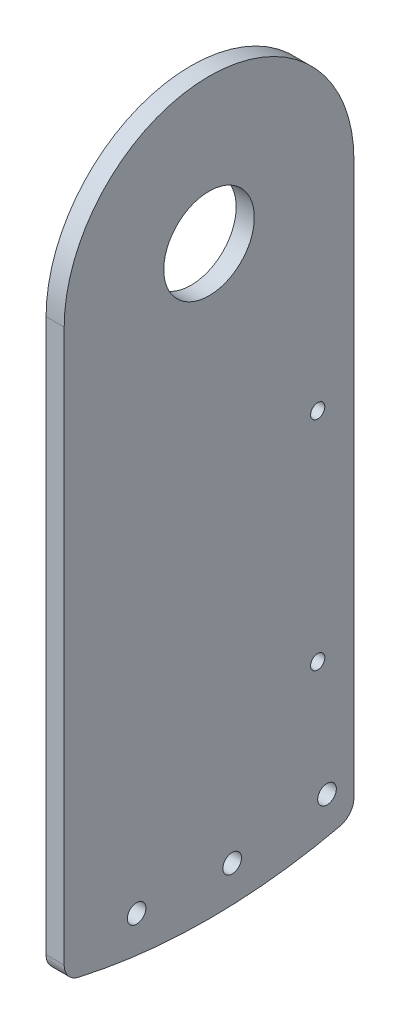
ISO-10303-21;
HEADER;
FILE_DESCRIPTION(('STEP AP214'),'2;1');
FILE_NAME('part.step','',(''),(''),'','','');
FILE_SCHEMA(('AUTOMOTIVE_DESIGN { 1 0 10303 214 1 1 1 1 }'));
ENDSEC;
DATA;
#1=APPLICATION_CONTEXT('core data for automotive mechanical design processes');
#2=APPLICATION_PROTOCOL_DEFINITION('international standard','automotive_design',2000,#1);
#3=PRODUCT_CONTEXT('',#1,'mechanical');
#4=PRODUCT('Part','Part','',(#3));
#5=PRODUCT_RELATED_PRODUCT_CATEGORY('part','',(#4));
#6=PRODUCT_DEFINITION_FORMATION('','',#4);
#7=PRODUCT_DEFINITION_CONTEXT('part definition',#1,'design');
#8=PRODUCT_DEFINITION('design','',#6,#7);
#9=PRODUCT_DEFINITION_SHAPE('','',#8);
#10=(LENGTH_UNIT() NAMED_UNIT(*) SI_UNIT(.MILLI.,.METRE.));
#11=(NAMED_UNIT(*) PLANE_ANGLE_UNIT() SI_UNIT($,.RADIAN.));
#12=(NAMED_UNIT(*) SI_UNIT($,.STERADIAN.) SOLID_ANGLE_UNIT());
#13=UNCERTAINTY_MEASURE_WITH_UNIT(LENGTH_MEASURE(1.E-05),#10,'distance_accuracy_value','');
#14=(GEOMETRIC_REPRESENTATION_CONTEXT(3) GLOBAL_UNCERTAINTY_ASSIGNED_CONTEXT((#13)) GLOBAL_UNIT_ASSIGNED_CONTEXT((#10,
#11,#12)) REPRESENTATION_CONTEXT('',''));
#15=CARTESIAN_POINT('',(0.,0.,0.));
#16=DIRECTION('',(0.,0.,1.));
#17=DIRECTION('',(1.,0.,0.));
#18=AXIS2_PLACEMENT_3D('',#15,#16,#17);
#19=CARTESIAN_POINT('',(6.35,0.,0.));
#20=DIRECTION('',(-1.,0.,0.));
#21=DIRECTION('',(0.,0.,-1.));
#22=AXIS2_PLACEMENT_3D('',#19,#20,#21);
#23=PLANE('',#22);
#24=CARTESIAN_POINT('',(6.35,-146.05,-38.1));
#25=DIRECTION('',(-1.,0.,0.));
#26=DIRECTION('',(0.,0.,1.));
#27=AXIS2_PLACEMENT_3D('',#24,#25,#26);
#28=CIRCLE('',#27,2.4892);
#29=CARTESIAN_POINT('',(6.35,-146.05,-35.6108));
#30=VERTEX_POINT('',#29);
#31=EDGE_CURVE('E289',#30,#30,#28,.T.);
#32=ORIENTED_EDGE('',*,*,#31,.T.);
#33=EDGE_LOOP('',(#32));
#34=FACE_BOUND('',#33,.T.);
#35=CARTESIAN_POINT('',(6.35,-69.85,-38.1));
#36=DIRECTION('',(-1.,0.,0.));
#37=DIRECTION('',(0.,0.,1.));
#38=AXIS2_PLACEMENT_3D('',#35,#36,#37);
#39=CIRCLE('',#38,2.48919999999998);
#40=CARTESIAN_POINT('',(6.35,-69.85,-35.6108));
#41=VERTEX_POINT('',#40);
#42=EDGE_CURVE('E291',#41,#41,#39,.T.);
#43=ORIENTED_EDGE('',*,*,#42,.T.);
#44=EDGE_LOOP('',(#43));
#45=FACE_BOUND('',#44,.T.);
#46=CARTESIAN_POINT('',(6.35,-190.721063401503,25.4));
#47=DIRECTION('',(-1.,0.,0.));
#48=DIRECTION('',(0.,0.,1.));
#49=AXIS2_PLACEMENT_3D('',#46,#47,#48);
#50=CIRCLE('',#49,3.26389999999999);
#51=CARTESIAN_POINT('',(6.35,-190.721063401503,28.6639));
#52=VERTEX_POINT('',#51);
#53=EDGE_CURVE('E299',#52,#52,#50,.T.);
#54=ORIENTED_EDGE('',*,*,#53,.T.);
#55=EDGE_LOOP('',(#54));
#56=FACE_BOUND('',#55,.T.);
#57=CARTESIAN_POINT('',(6.35,-192.234245613273,-8.10424817586003));
#58=DIRECTION('',(-1.,0.,0.));
#59=DIRECTION('',(0.,0.,1.));
#60=AXIS2_PLACEMENT_3D('',#57,#58,#59);
#61=CIRCLE('',#60,3.26389999999999);
#62=CARTESIAN_POINT('',(6.35,-192.234245613273,-4.84034817586005));
#63=VERTEX_POINT('',#62);
#64=EDGE_CURVE('E305',#63,#63,#61,.T.);
#65=ORIENTED_EDGE('',*,*,#64,.T.);
#66=EDGE_LOOP('',(#65));
#67=FACE_BOUND('',#66,.T.);
#68=CARTESIAN_POINT('',(6.35,-187.906487547305,-41.362252871844));
#69=DIRECTION('',(-1.,0.,0.));
#70=DIRECTION('',(0.,0.,1.));
#71=AXIS2_PLACEMENT_3D('',#68,#69,#70);
#72=CIRCLE('',#71,3.26389999999999);
#73=CARTESIAN_POINT('',(6.35,-187.906487547305,-38.098352871844));
#74=VERTEX_POINT('',#73);
#75=EDGE_CURVE('E311',#74,#74,#72,.T.);
#76=ORIENTED_EDGE('',*,*,#75,.T.);
#77=EDGE_LOOP('',(#76));
#78=FACE_BOUND('',#77,.T.);
#79=CARTESIAN_POINT('',(6.35,0.,0.));
#80=DIRECTION('',(-1.,0.,0.));
#81=DIRECTION('',(0.,0.,1.));
#82=AXIS2_PLACEMENT_3D('',#79,#80,#81);
#83=CIRCLE('',#82,205.105);
#84=CARTESIAN_POINT('',(6.35,-199.909960734882,-45.8701277955271));
#85=VERTEX_POINT('',#84);
#86=CARTESIAN_POINT('',(6.35,-199.909960734882,45.8701277955272));
#87=VERTEX_POINT('',#86);
#88=EDGE_CURVE('E120',#85,#87,#83,.T.);
#89=ORIENTED_EDGE('',*,*,#88,.F.);
#90=CARTESIAN_POINT('',(6.35,-193.720797863833,-44.4499999999999));
#91=DIRECTION('',(1.,0.,0.));
#92=DIRECTION('',(0.,0.,-1.));
#93=AXIS2_PLACEMENT_3D('',#90,#91,#92);
#94=CIRCLE('',#93,6.35);
#95=CARTESIAN_POINT('',(6.35,-193.720797863833,-50.7999999999999));
#96=VERTEX_POINT('',#95);
#97=EDGE_CURVE('E119',#96,#85,#94,.F.);
#98=ORIENTED_EDGE('',*,*,#97,.F.);
#99=DIRECTION('',(0.,-1.,0.));
#100=VECTOR('',#99,1.);
#101=CARTESIAN_POINT('',(6.35,0.,-50.8));
#102=LINE('',#101,#100);
#103=CARTESIAN_POINT('',(6.35,0.,-50.8));
#104=VERTEX_POINT('',#103);
#105=EDGE_CURVE('E99',#104,#96,#102,.T.);
#106=ORIENTED_EDGE('',*,*,#105,.F.);
#107=CARTESIAN_POINT('',(6.35,0.,0.));
#108=DIRECTION('',(-1.,0.,0.));
#109=DIRECTION('',(0.,0.,-1.));
#110=AXIS2_PLACEMENT_3D('',#107,#108,#109);
#111=CIRCLE('',#110,50.8);
#112=CARTESIAN_POINT('',(6.35,0.,50.8));
#113=VERTEX_POINT('',#112);
#114=EDGE_CURVE('E110',#113,#104,#111,.T.);
#115=ORIENTED_EDGE('',*,*,#114,.F.);
#116=DIRECTION('',(0.,1.,0.));
#117=VECTOR('',#116,1.);
#118=CARTESIAN_POINT('',(6.35,0.,50.8));
#119=LINE('',#118,#117);
#120=CARTESIAN_POINT('',(6.35,-193.720797863833,50.8));
#121=VERTEX_POINT('',#120);
#122=EDGE_CURVE('E123',#121,#113,#119,.T.);
#123=ORIENTED_EDGE('',*,*,#122,.F.);
#124=CARTESIAN_POINT('',(6.35,-193.720797863833,44.45));
#125=DIRECTION('',(1.,0.,0.));
#126=DIRECTION('',(0.,0.,-1.));
#127=AXIS2_PLACEMENT_3D('',#124,#125,#126);
#128=CIRCLE('',#127,6.35);
#129=EDGE_CURVE('E51',#87,#121,#128,.F.);
#130=ORIENTED_EDGE('',*,*,#129,.F.);
#131=EDGE_LOOP('',(#89,#98,#106,#115,#123,#130));
#132=FACE_BOUND('',#131,.T.);
#133=CARTESIAN_POINT('',(6.35,0.,0.));
#134=DIRECTION('',(-1.,0.,0.));
#135=DIRECTION('',(0.,0.,1.));
#136=AXIS2_PLACEMENT_3D('',#133,#134,#135);
#137=CIRCLE('',#136,15.875);
#138=CARTESIAN_POINT('',(6.35,0.,15.875));
#139=VERTEX_POINT('',#138);
#140=EDGE_CURVE('E130',#139,#139,#137,.T.);
#141=ORIENTED_EDGE('',*,*,#140,.T.);
#142=EDGE_LOOP('',(#141));
#143=FACE_BOUND('',#142,.T.);
#144=ADVANCED_FACE('F43',(#34,#45,#56,#67,#78,#132,#143),#23,.F.);
#145=CARTESIAN_POINT('',(0.,0.,0.));
#146=DIRECTION('',(-1.,0.,0.));
#147=DIRECTION('',(0.,0.,-1.));
#148=AXIS2_PLACEMENT_3D('',#145,#146,#147);
#149=PLANE('',#148);
#150=CARTESIAN_POINT('',(0.,-146.05,-38.1));
#151=DIRECTION('',(-1.,0.,0.));
#152=DIRECTION('',(0.,0.,1.));
#153=AXIS2_PLACEMENT_3D('',#150,#151,#152);
#154=CIRCLE('',#153,2.4892);
#155=CARTESIAN_POINT('',(0.,-146.05,-35.6108));
#156=VERTEX_POINT('',#155);
#157=EDGE_CURVE('E287',#156,#156,#154,.T.);
#158=ORIENTED_EDGE('',*,*,#157,.F.);
#159=EDGE_LOOP('',(#158));
#160=FACE_BOUND('',#159,.T.);
#161=CARTESIAN_POINT('',(0.,-69.85,-38.1));
#162=DIRECTION('',(-1.,0.,0.));
#163=DIRECTION('',(0.,0.,1.));
#164=AXIS2_PLACEMENT_3D('',#161,#162,#163);
#165=CIRCLE('',#164,2.4892);
#166=CARTESIAN_POINT('',(0.,-69.85,-35.6108));
#167=VERTEX_POINT('',#166);
#168=EDGE_CURVE('E296',#167,#167,#165,.T.);
#169=ORIENTED_EDGE('',*,*,#168,.F.);
#170=EDGE_LOOP('',(#169));
#171=FACE_BOUND('',#170,.T.);
#172=CARTESIAN_POINT('',(0.,-190.721063401503,25.4));
#173=DIRECTION('',(-1.,0.,0.));
#174=DIRECTION('',(0.,0.,1.));
#175=AXIS2_PLACEMENT_3D('',#172,#173,#174);
#176=CIRCLE('',#175,3.26389999999999);
#177=CARTESIAN_POINT('',(0.,-190.721063401503,28.6639));
#178=VERTEX_POINT('',#177);
#179=EDGE_CURVE('E302',#178,#178,#176,.T.);
#180=ORIENTED_EDGE('',*,*,#179,.F.);
#181=EDGE_LOOP('',(#180));
#182=FACE_BOUND('',#181,.T.);
#183=CARTESIAN_POINT('',(0.,-192.234245613273,-8.10424817586003));
#184=DIRECTION('',(-1.,0.,0.));
#185=DIRECTION('',(0.,0.,1.));
#186=AXIS2_PLACEMENT_3D('',#183,#184,#185);
#187=CIRCLE('',#186,3.26389999999999);
#188=CARTESIAN_POINT('',(0.,-192.234245613273,-4.84034817586005));
#189=VERTEX_POINT('',#188);
#190=EDGE_CURVE('E308',#189,#189,#187,.T.);
#191=ORIENTED_EDGE('',*,*,#190,.F.);
#192=EDGE_LOOP('',(#191));
#193=FACE_BOUND('',#192,.T.);
#194=CARTESIAN_POINT('',(0.,-187.906487547305,-41.362252871844));
#195=DIRECTION('',(-1.,0.,0.));
#196=DIRECTION('',(0.,0.,1.));
#197=AXIS2_PLACEMENT_3D('',#194,#195,#196);
#198=CIRCLE('',#197,3.26389999999999);
#199=CARTESIAN_POINT('',(0.,-187.906487547305,-38.098352871844));
#200=VERTEX_POINT('',#199);
#201=EDGE_CURVE('E314',#200,#200,#198,.T.);
#202=ORIENTED_EDGE('',*,*,#201,.F.);
#203=EDGE_LOOP('',(#202));
#204=FACE_BOUND('',#203,.T.);
#205=DIRECTION('',(0.,1.,0.));
#206=VECTOR('',#205,1.);
#207=CARTESIAN_POINT('',(0.,0.,50.8));
#208=LINE('',#207,#206);
#209=CARTESIAN_POINT('',(0.,-193.720797863833,50.8));
#210=VERTEX_POINT('',#209);
#211=CARTESIAN_POINT('',(0.,0.,50.8));
#212=VERTEX_POINT('',#211);
#213=EDGE_CURVE('E115',#210,#212,#208,.T.);
#214=ORIENTED_EDGE('',*,*,#213,.T.);
#215=CARTESIAN_POINT('',(0.,0.,0.));
#216=DIRECTION('',(-1.,0.,0.));
#217=DIRECTION('',(0.,0.,-1.));
#218=AXIS2_PLACEMENT_3D('',#215,#216,#217);
#219=CIRCLE('',#218,50.8);
#220=CARTESIAN_POINT('',(0.,0.,-50.8));
#221=VERTEX_POINT('',#220);
#222=EDGE_CURVE('E128',#212,#221,#219,.T.);
#223=ORIENTED_EDGE('',*,*,#222,.T.);
#224=DIRECTION('',(0.,-1.,0.));
#225=VECTOR('',#224,1.);
#226=CARTESIAN_POINT('',(0.,0.,-50.8));
#227=LINE('',#226,#225);
#228=CARTESIAN_POINT('',(0.,-193.720797863833,-50.7999999999999));
#229=VERTEX_POINT('',#228);
#230=EDGE_CURVE('E102',#221,#229,#227,.T.);
#231=ORIENTED_EDGE('',*,*,#230,.T.);
#232=CARTESIAN_POINT('',(0.,-193.720797863833,-44.4499999999999));
#233=DIRECTION('',(1.,0.,0.));
#234=DIRECTION('',(0.,0.,-1.));
#235=AXIS2_PLACEMENT_3D('',#232,#233,#234);
#236=CIRCLE('',#235,6.35);
#237=CARTESIAN_POINT('',(0.,-199.909960734882,-45.8701277955271));
#238=VERTEX_POINT('',#237);
#239=EDGE_CURVE('E139',#238,#229,#236,.T.);
#240=ORIENTED_EDGE('',*,*,#239,.F.);
#241=CARTESIAN_POINT('',(0.,0.,0.));
#242=DIRECTION('',(-1.,0.,0.));
#243=DIRECTION('',(0.,0.,1.));
#244=AXIS2_PLACEMENT_3D('',#241,#242,#243);
#245=CIRCLE('',#244,205.105);
#246=CARTESIAN_POINT('',(0.,-199.909960734882,45.8701277955272));
#247=VERTEX_POINT('',#246);
#248=EDGE_CURVE('E132',#238,#247,#245,.T.);
#249=ORIENTED_EDGE('',*,*,#248,.T.);
#250=CARTESIAN_POINT('',(0.,-193.720797863833,44.45));
#251=DIRECTION('',(1.,0.,0.));
#252=DIRECTION('',(0.,0.,-1.));
#253=AXIS2_PLACEMENT_3D('',#250,#251,#252);
#254=CIRCLE('',#253,6.35);
#255=EDGE_CURVE('E141',#210,#247,#254,.T.);
#256=ORIENTED_EDGE('',*,*,#255,.F.);
#257=EDGE_LOOP('',(#214,#223,#231,#240,#249,#256));
#258=FACE_BOUND('',#257,.T.);
#259=CARTESIAN_POINT('',(0.,0.,0.));
#260=DIRECTION('',(-1.,0.,0.));
#261=DIRECTION('',(0.,0.,1.));
#262=AXIS2_PLACEMENT_3D('',#259,#260,#261);
#263=CIRCLE('',#262,15.875);
#264=CARTESIAN_POINT('',(0.,0.,15.875));
#265=VERTEX_POINT('',#264);
#266=EDGE_CURVE('E317',#265,#265,#263,.T.);
#267=ORIENTED_EDGE('',*,*,#266,.F.);
#268=EDGE_LOOP('',(#267));
#269=FACE_BOUND('',#268,.T.);
#270=ADVANCED_FACE('F152',(#160,#171,#182,#193,#204,#258,#269),#149,.T.);
#271=CARTESIAN_POINT('',(6.35,0.,0.));
#272=DIRECTION('',(-1.,0.,0.));
#273=DIRECTION('',(0.,0.,-1.));
#274=AXIS2_PLACEMENT_3D('',#271,#272,#273);
#275=CYLINDRICAL_SURFACE('',#274,50.8);
#276=ORIENTED_EDGE('',*,*,#222,.F.);
#277=DIRECTION('',(-1.,0.,0.));
#278=VECTOR('',#277,1.);
#279=CARTESIAN_POINT('',(6.35,0.,50.8));
#280=LINE('',#279,#278);
#281=EDGE_CURVE('E107',#113,#212,#280,.T.);
#282=ORIENTED_EDGE('',*,*,#281,.F.);
#283=ORIENTED_EDGE('',*,*,#114,.T.);
#284=DIRECTION('',(-1.,0.,0.));
#285=VECTOR('',#284,1.);
#286=CARTESIAN_POINT('',(6.35,0.,-50.8));
#287=LINE('',#286,#285);
#288=EDGE_CURVE('E95',#104,#221,#287,.T.);
#289=ORIENTED_EDGE('',*,*,#288,.T.);
#290=EDGE_LOOP('',(#276,#282,#283,#289));
#291=FACE_BOUND('',#290,.T.);
#292=ADVANCED_FACE('F111',(#291),#275,.T.);
#293=CARTESIAN_POINT('',(6.35,0.,-50.8));
#294=DIRECTION('',(0.,0.,1.));
#295=DIRECTION('',(0.,1.,0.));
#296=AXIS2_PLACEMENT_3D('',#293,#294,#295);
#297=PLANE('',#296);
#298=ORIENTED_EDGE('',*,*,#230,.F.);
#299=ORIENTED_EDGE('',*,*,#288,.F.);
#300=ORIENTED_EDGE('',*,*,#105,.T.);
#301=DIRECTION('',(-1.,0.,0.));
#302=VECTOR('',#301,1.);
#303=CARTESIAN_POINT('',(6.35,-193.720797863833,-50.7999999999999));
#304=LINE('',#303,#302);
#305=EDGE_CURVE('E11',#229,#96,#304,.F.);
#306=ORIENTED_EDGE('',*,*,#305,.F.);
#307=EDGE_LOOP('',(#298,#299,#300,#306));
#308=FACE_BOUND('',#307,.T.);
#309=ADVANCED_FACE('F97',(#308),#297,.F.);
#310=CARTESIAN_POINT('',(6.35,0.,0.));
#311=DIRECTION('',(-1.,0.,0.));
#312=DIRECTION('',(0.,0.,-1.));
#313=AXIS2_PLACEMENT_3D('',#310,#311,#312);
#314=CYLINDRICAL_SURFACE('',#313,205.105);
#315=ORIENTED_EDGE('',*,*,#248,.F.);
#316=DIRECTION('',(-1.,0.,0.));
#317=VECTOR('',#316,1.);
#318=CARTESIAN_POINT('',(6.35,-199.909960734882,-45.8701277955271));
#319=LINE('',#318,#317);
#320=EDGE_CURVE('E143',#85,#238,#319,.T.);
#321=ORIENTED_EDGE('',*,*,#320,.F.);
#322=ORIENTED_EDGE('',*,*,#88,.T.);
#323=DIRECTION('',(-1.,0.,0.));
#324=VECTOR('',#323,1.);
#325=CARTESIAN_POINT('',(6.35,-199.909960734882,45.8701277955272));
#326=LINE('',#325,#324);
#327=EDGE_CURVE('E64',#247,#87,#326,.F.);
#328=ORIENTED_EDGE('',*,*,#327,.F.);
#329=EDGE_LOOP('',(#315,#321,#322,#328));
#330=FACE_BOUND('',#329,.T.);
#331=ADVANCED_FACE('F157',(#330),#314,.T.);
#332=CARTESIAN_POINT('',(6.35,0.,50.8));
#333=DIRECTION('',(0.,0.,-1.));
#334=DIRECTION('',(0.,-1.,0.));
#335=AXIS2_PLACEMENT_3D('',#332,#333,#334);
#336=PLANE('',#335);
#337=ORIENTED_EDGE('',*,*,#122,.T.);
#338=ORIENTED_EDGE('',*,*,#281,.T.);
#339=ORIENTED_EDGE('',*,*,#213,.F.);
#340=DIRECTION('',(-1.,0.,0.));
#341=VECTOR('',#340,1.);
#342=CARTESIAN_POINT('',(6.35,-193.720797863833,50.8));
#343=LINE('',#342,#341);
#344=EDGE_CURVE('E106',#121,#210,#343,.T.);
#345=ORIENTED_EDGE('',*,*,#344,.F.);
#346=EDGE_LOOP('',(#337,#338,#339,#345));
#347=FACE_BOUND('',#346,.T.);
#348=ADVANCED_FACE('F149',(#347),#336,.F.);
#349=CARTESIAN_POINT('',(6.35,0.,0.));
#350=DIRECTION('',(-1.,0.,0.));
#351=DIRECTION('',(0.,0.,-1.));
#352=AXIS2_PLACEMENT_3D('',#349,#350,#351);
#353=CYLINDRICAL_SURFACE('',#352,15.875);
#354=ORIENTED_EDGE('',*,*,#140,.F.);
#355=EDGE_LOOP('',(#354));
#356=FACE_BOUND('',#355,.T.);
#357=ORIENTED_EDGE('',*,*,#266,.T.);
#358=EDGE_LOOP('',(#357));
#359=FACE_BOUND('',#358,.T.);
#360=ADVANCED_FACE('F174',(#356,#359),#353,.F.);
#361=CARTESIAN_POINT('',(6.35,-187.906487547305,-41.362252871844));
#362=DIRECTION('',(1.,0.,0.));
#363=DIRECTION('',(0.,0.,1.));
#364=AXIS2_PLACEMENT_3D('',#361,#362,#363);
#365=CYLINDRICAL_SURFACE('',#364,3.26389999999999);
#366=ORIENTED_EDGE('',*,*,#201,.T.);
#367=EDGE_LOOP('',(#366));
#368=FACE_BOUND('',#367,.T.);
#369=ORIENTED_EDGE('',*,*,#75,.F.);
#370=EDGE_LOOP('',(#369));
#371=FACE_BOUND('',#370,.T.);
#372=ADVANCED_FACE('F210',(#368,#371),#365,.F.);
#373=CARTESIAN_POINT('',(6.35,-192.234245613273,-8.10424817586003));
#374=DIRECTION('',(1.,0.,0.));
#375=DIRECTION('',(0.,0.,1.));
#376=AXIS2_PLACEMENT_3D('',#373,#374,#375);
#377=CYLINDRICAL_SURFACE('',#376,3.26389999999999);
#378=ORIENTED_EDGE('',*,*,#190,.T.);
#379=EDGE_LOOP('',(#378));
#380=FACE_BOUND('',#379,.T.);
#381=ORIENTED_EDGE('',*,*,#64,.F.);
#382=EDGE_LOOP('',(#381));
#383=FACE_BOUND('',#382,.T.);
#384=ADVANCED_FACE('F218',(#380,#383),#377,.F.);
#385=CARTESIAN_POINT('',(6.35,-190.721063401503,25.4));
#386=DIRECTION('',(1.,0.,0.));
#387=DIRECTION('',(0.,0.,1.));
#388=AXIS2_PLACEMENT_3D('',#385,#386,#387);
#389=CYLINDRICAL_SURFACE('',#388,3.26389999999999);
#390=ORIENTED_EDGE('',*,*,#179,.T.);
#391=EDGE_LOOP('',(#390));
#392=FACE_BOUND('',#391,.T.);
#393=ORIENTED_EDGE('',*,*,#53,.F.);
#394=EDGE_LOOP('',(#393));
#395=FACE_BOUND('',#394,.T.);
#396=ADVANCED_FACE('F226',(#392,#395),#389,.F.);
#397=CARTESIAN_POINT('',(6.35,-69.85,-38.1));
#398=DIRECTION('',(1.,0.,0.));
#399=DIRECTION('',(0.,0.,1.));
#400=AXIS2_PLACEMENT_3D('',#397,#398,#399);
#401=CYLINDRICAL_SURFACE('',#400,2.48919999999999);
#402=ORIENTED_EDGE('',*,*,#168,.T.);
#403=EDGE_LOOP('',(#402));
#404=FACE_BOUND('',#403,.T.);
#405=ORIENTED_EDGE('',*,*,#42,.F.);
#406=EDGE_LOOP('',(#405));
#407=FACE_BOUND('',#406,.T.);
#408=ADVANCED_FACE('F235',(#404,#407),#401,.F.);
#409=CARTESIAN_POINT('',(6.35,-146.05,-38.1));
#410=DIRECTION('',(1.,0.,0.));
#411=DIRECTION('',(0.,0.,1.));
#412=AXIS2_PLACEMENT_3D('',#409,#410,#411);
#413=CYLINDRICAL_SURFACE('',#412,2.4892);
#414=ORIENTED_EDGE('',*,*,#157,.T.);
#415=EDGE_LOOP('',(#414));
#416=FACE_BOUND('',#415,.T.);
#417=ORIENTED_EDGE('',*,*,#31,.F.);
#418=EDGE_LOOP('',(#417));
#419=FACE_BOUND('',#418,.T.);
#420=ADVANCED_FACE('F162',(#416,#419),#413,.F.);
#421=CARTESIAN_POINT('',(6.35,-193.720797863833,44.45));
#422=DIRECTION('',(-1.,0.,0.));
#423=DIRECTION('',(0.,0.,-1.));
#424=AXIS2_PLACEMENT_3D('',#421,#422,#423);
#425=CYLINDRICAL_SURFACE('',#424,6.35);
#426=ORIENTED_EDGE('',*,*,#129,.T.);
#427=ORIENTED_EDGE('',*,*,#344,.T.);
#428=ORIENTED_EDGE('',*,*,#255,.T.);
#429=ORIENTED_EDGE('',*,*,#327,.T.);
#430=EDGE_LOOP('',(#426,#427,#428,#429));
#431=FACE_BOUND('',#430,.T.);
#432=ADVANCED_FACE('F146',(#431),#425,.T.);
#433=CARTESIAN_POINT('',(6.35,-193.720797863833,-44.4499999999999));
#434=DIRECTION('',(-1.,0.,0.));
#435=DIRECTION('',(0.,0.,-1.));
#436=AXIS2_PLACEMENT_3D('',#433,#434,#435);
#437=CYLINDRICAL_SURFACE('',#436,6.35);
#438=ORIENTED_EDGE('',*,*,#97,.T.);
#439=ORIENTED_EDGE('',*,*,#320,.T.);
#440=ORIENTED_EDGE('',*,*,#239,.T.);
#441=ORIENTED_EDGE('',*,*,#305,.T.);
#442=EDGE_LOOP('',(#438,#439,#440,#441));
#443=FACE_BOUND('',#442,.T.);
#444=ADVANCED_FACE('F45',(#443),#437,.T.);
#445=CLOSED_SHELL('',(#144,#270,#292,#309,#331,#348,#360,#372,#384,#396,#408,#420,#432,#444));
#446=MANIFOLD_SOLID_BREP('B2',#445);
#447=ADVANCED_BREP_SHAPE_REPRESENTATION('',(#18,#446),#14);
#448=SHAPE_DEFINITION_REPRESENTATION(#9,#447);
ENDSEC;
END-ISO-10303-21;
